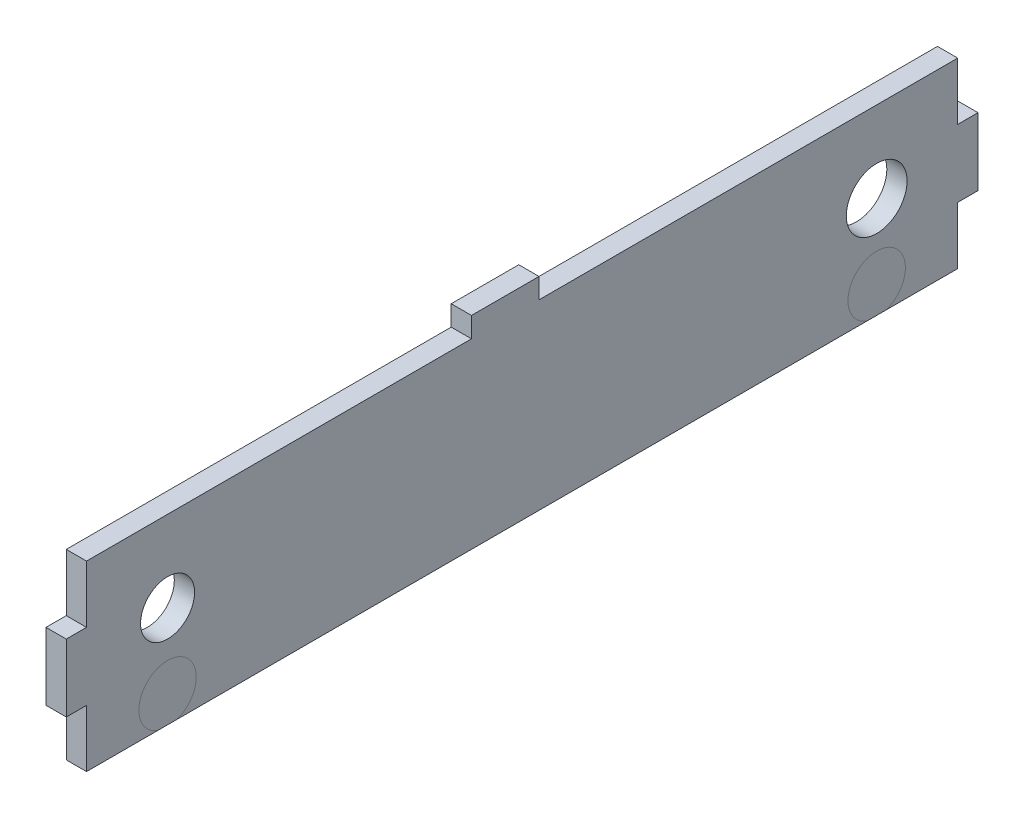
ISO-10303-21;
HEADER;
FILE_DESCRIPTION(('STEP AP214'),'2;1');
FILE_NAME('part.step','',(''),(''),'','','');
FILE_SCHEMA(('AUTOMOTIVE_DESIGN { 1 0 10303 214 1 1 1 1 }'));
ENDSEC;
DATA;
#1=APPLICATION_CONTEXT('core data for automotive mechanical design processes');
#2=APPLICATION_PROTOCOL_DEFINITION('international standard','automotive_design',2000,#1);
#3=PRODUCT_CONTEXT('',#1,'mechanical');
#4=PRODUCT('Part','Part','',(#3));
#5=PRODUCT_RELATED_PRODUCT_CATEGORY('part','',(#4));
#6=PRODUCT_DEFINITION_FORMATION('','',#4);
#7=PRODUCT_DEFINITION_CONTEXT('part definition',#1,'design');
#8=PRODUCT_DEFINITION('design','',#6,#7);
#9=PRODUCT_DEFINITION_SHAPE('','',#8);
#10=(LENGTH_UNIT() NAMED_UNIT(*) SI_UNIT(.MILLI.,.METRE.));
#11=(NAMED_UNIT(*) PLANE_ANGLE_UNIT() SI_UNIT($,.RADIAN.));
#12=(NAMED_UNIT(*) SI_UNIT($,.STERADIAN.) SOLID_ANGLE_UNIT());
#13=UNCERTAINTY_MEASURE_WITH_UNIT(LENGTH_MEASURE(1.E-05),#10,'distance_accuracy_value','');
#14=(GEOMETRIC_REPRESENTATION_CONTEXT(3) GLOBAL_UNCERTAINTY_ASSIGNED_CONTEXT((#13)) GLOBAL_UNIT_ASSIGNED_CONTEXT((#10,
#11,#12)) REPRESENTATION_CONTEXT('',''));
#15=CARTESIAN_POINT('',(0.,0.,0.));
#16=DIRECTION('',(0.,0.,1.));
#17=DIRECTION('',(1.,0.,0.));
#18=AXIS2_PLACEMENT_3D('',#15,#16,#17);
#19=CARTESIAN_POINT('',(-313.51,39.5000001110803,221.989999999999));
#20=CARTESIAN_POINT('',(-313.51,39.5000001110803,225.009999999999));
#21=CARTESIAN_POINT('',(-310.49,39.5000001110803,221.989999999999));
#22=CARTESIAN_POINT('',(-310.49,39.5000001110803,225.009999999999));
#23=(BOUNDED_SURFACE() B_SPLINE_SURFACE(1,1,((#19,#20),(#21,#22)),.UNSPECIFIED.,.F.,.F.,
.F.) B_SPLINE_SURFACE_WITH_KNOTS((2,2),(2,2),(-0.001,0.301),(-0.001,0.301),
.UNSPECIFIED.) GEOMETRIC_REPRESENTATION_ITEM() RATIONAL_B_SPLINE_SURFACE(((1.,1.),(1.,1.))) REPRESENTATION_ITEM('') SURFACE());
#24=CARTESIAN_POINT('',(-310.5,39.5000001110803,221.999999999999));
#25=CARTESIAN_POINT('',(-313.5,39.5000001110803,221.999999999999));
#26=(BOUNDED_CURVE() B_SPLINE_CURVE(1,(#24,#25),.UNSPECIFIED.,.F.,
.F.) B_SPLINE_CURVE_WITH_KNOTS((2,2),(-0.15,0.15),
.UNSPECIFIED.) CURVE() GEOMETRIC_REPRESENTATION_ITEM() RATIONAL_B_SPLINE_CURVE((1.,1.)) REPRESENTATION_ITEM(''));
#27=CARTESIAN_POINT('',(-310.5,39.5000001110803,221.999999999999));
#28=VERTEX_POINT('',#27);
#29=CARTESIAN_POINT('',(-313.5,39.5000001110803,221.999999999999));
#30=VERTEX_POINT('',#29);
#31=EDGE_CURVE('E64',#28,#30,#26,.T.);
#32=CARTESIAN_POINT('',(-310.5,39.5000001110803,221.999999999999));
#33=CARTESIAN_POINT('',(-310.5,39.5000001110803,224.999999999999));
#34=(BOUNDED_CURVE() B_SPLINE_CURVE(1,(#32,#33),.UNSPECIFIED.,.F.,
.F.) B_SPLINE_CURVE_WITH_KNOTS((2,2),(0.,0.3),
.UNSPECIFIED.) CURVE() GEOMETRIC_REPRESENTATION_ITEM() RATIONAL_B_SPLINE_CURVE((1.,1.)) REPRESENTATION_ITEM(''));
#35=CARTESIAN_POINT('',(-310.5,39.5000001110803,224.999999999999));
#36=VERTEX_POINT('',#35);
#37=EDGE_CURVE('E49',#28,#36,#34,.T.);
#38=CARTESIAN_POINT('',(-313.5,39.5000001110803,224.999999999999));
#39=CARTESIAN_POINT('',(-310.5,39.5000001110803,224.999999999999));
#40=(BOUNDED_CURVE() B_SPLINE_CURVE(1,(#38,#39),.UNSPECIFIED.,.F.,
.F.) B_SPLINE_CURVE_WITH_KNOTS((2,2),(-0.3,0.),
.UNSPECIFIED.) CURVE() GEOMETRIC_REPRESENTATION_ITEM() RATIONAL_B_SPLINE_CURVE((1.,1.)) REPRESENTATION_ITEM(''));
#41=CARTESIAN_POINT('',(-313.5,39.5000001110803,224.999999999999));
#42=VERTEX_POINT('',#41);
#43=EDGE_CURVE('E335',#42,#36,#40,.T.);
#44=CARTESIAN_POINT('',(-313.5,39.5000001110803,221.999999999999));
#45=CARTESIAN_POINT('',(-313.5,39.5000001110803,224.999999999999));
#46=(BOUNDED_CURVE() B_SPLINE_CURVE(1,(#44,#45),.UNSPECIFIED.,.F.,
.F.) B_SPLINE_CURVE_WITH_KNOTS((2,2),(0.,0.3),
.UNSPECIFIED.) CURVE() GEOMETRIC_REPRESENTATION_ITEM() RATIONAL_B_SPLINE_CURVE((1.,1.)) REPRESENTATION_ITEM(''));
#47=EDGE_CURVE('E221',#30,#42,#46,.T.);
#48=ORIENTED_EDGE('',*,*,#31,.F.);
#49=ORIENTED_EDGE('',*,*,#37,.T.);
#50=ORIENTED_EDGE('',*,*,#43,.F.);
#51=ORIENTED_EDGE('',*,*,#47,.F.);
#52=EDGE_LOOP('',(#48,#49,#50,#51));
#53=FACE_BOUND('',#52,.T.);
#54=ADVANCED_FACE('F39',(#53),#23,.T.);
#55=CARTESIAN_POINT('',(-310.49,49.5000001110803,221.989999999999));
#56=CARTESIAN_POINT('',(-310.49,49.5000001110803,225.009999999999));
#57=CARTESIAN_POINT('',(-313.51,49.5000001110803,221.989999999999));
#58=CARTESIAN_POINT('',(-313.51,49.5000001110803,225.009999999999));
#59=(BOUNDED_SURFACE() B_SPLINE_SURFACE(1,1,((#55,#56),(#57,#58)),.UNSPECIFIED.,.F.,.F.,
.F.) B_SPLINE_SURFACE_WITH_KNOTS((2,2),(2,2),(-0.001,0.301),(-0.001,0.301),
.UNSPECIFIED.) GEOMETRIC_REPRESENTATION_ITEM() RATIONAL_B_SPLINE_SURFACE(((1.,1.),(1.,1.))) REPRESENTATION_ITEM('') SURFACE());
#60=CARTESIAN_POINT('',(-313.5,49.5000001110803,221.999999999999));
#61=CARTESIAN_POINT('',(-310.5,49.5000001110803,221.999999999999));
#62=(BOUNDED_CURVE() B_SPLINE_CURVE(1,(#60,#61),.UNSPECIFIED.,.F.,
.F.) B_SPLINE_CURVE_WITH_KNOTS((2,2),(-0.3,0.),
.UNSPECIFIED.) CURVE() GEOMETRIC_REPRESENTATION_ITEM() RATIONAL_B_SPLINE_CURVE((1.,1.)) REPRESENTATION_ITEM(''));
#63=CARTESIAN_POINT('',(-313.5,49.5000001110803,221.999999999999));
#64=VERTEX_POINT('',#63);
#65=CARTESIAN_POINT('',(-310.5,49.5000001110803,221.999999999999));
#66=VERTEX_POINT('',#65);
#67=EDGE_CURVE('E336',#64,#66,#62,.T.);
#68=CARTESIAN_POINT('',(-313.5,49.5000001110803,221.999999999999));
#69=CARTESIAN_POINT('',(-313.5,49.5000001110803,224.999999999999));
#70=(BOUNDED_CURVE() B_SPLINE_CURVE(1,(#68,#69),.UNSPECIFIED.,.F.,
.F.) B_SPLINE_CURVE_WITH_KNOTS((2,2),(0.,0.3),
.UNSPECIFIED.) CURVE() GEOMETRIC_REPRESENTATION_ITEM() RATIONAL_B_SPLINE_CURVE((1.,1.)) REPRESENTATION_ITEM(''));
#71=CARTESIAN_POINT('',(-313.5,49.5000001110803,224.999999999999));
#72=VERTEX_POINT('',#71);
#73=EDGE_CURVE('E344',#64,#72,#70,.T.);
#74=CARTESIAN_POINT('',(-310.5,49.5000001110803,224.999999999999));
#75=CARTESIAN_POINT('',(-313.5,49.5000001110803,224.999999999999));
#76=(BOUNDED_CURVE() B_SPLINE_CURVE(1,(#74,#75),.UNSPECIFIED.,.F.,
.F.) B_SPLINE_CURVE_WITH_KNOTS((2,2),(0.,0.3),
.UNSPECIFIED.) CURVE() GEOMETRIC_REPRESENTATION_ITEM() RATIONAL_B_SPLINE_CURVE((1.,1.)) REPRESENTATION_ITEM(''));
#77=CARTESIAN_POINT('',(-310.5,49.5000001110803,224.999999999999));
#78=VERTEX_POINT('',#77);
#79=EDGE_CURVE('E90',#78,#72,#76,.T.);
#80=CARTESIAN_POINT('',(-310.5,49.5000001110803,221.999999999999));
#81=CARTESIAN_POINT('',(-310.5,49.5000001110803,224.999999999999));
#82=(BOUNDED_CURVE() B_SPLINE_CURVE(1,(#80,#81),.UNSPECIFIED.,.F.,
.F.) B_SPLINE_CURVE_WITH_KNOTS((2,2),(0.,0.3),
.UNSPECIFIED.) CURVE() GEOMETRIC_REPRESENTATION_ITEM() RATIONAL_B_SPLINE_CURVE((1.,1.)) REPRESENTATION_ITEM(''));
#83=EDGE_CURVE('E82',#66,#78,#82,.T.);
#84=ORIENTED_EDGE('',*,*,#67,.F.);
#85=ORIENTED_EDGE('',*,*,#73,.T.);
#86=ORIENTED_EDGE('',*,*,#79,.F.);
#87=ORIENTED_EDGE('',*,*,#83,.F.);
#88=EDGE_LOOP('',(#84,#85,#86,#87));
#89=FACE_BOUND('',#88,.T.);
#90=ADVANCED_FACE('F623',(#89),#59,.T.);
#91=CARTESIAN_POINT('',(-313.51,49.5100001110803,224.999999999999));
#92=CARTESIAN_POINT('',(-310.49,49.5100001110803,224.999999999999));
#93=CARTESIAN_POINT('',(-313.51,39.4900001110803,224.999999999999));
#94=CARTESIAN_POINT('',(-310.49,39.4900001110803,224.999999999999));
#95=(BOUNDED_SURFACE() B_SPLINE_SURFACE(1,1,((#91,#92),(#93,#94)),.UNSPECIFIED.,.F.,.F.,
.F.) B_SPLINE_SURFACE_WITH_KNOTS((2,2),(2,2),(-0.501,0.501),(-0.151,0.151),
.UNSPECIFIED.) GEOMETRIC_REPRESENTATION_ITEM() RATIONAL_B_SPLINE_SURFACE(((1.,1.),(1.,1.))) REPRESENTATION_ITEM('') SURFACE());
#96=CARTESIAN_POINT('',(-310.5,39.5000001110803,224.999999999999));
#97=CARTESIAN_POINT('',(-310.5,49.5000001110803,224.999999999999));
#98=(BOUNDED_CURVE() B_SPLINE_CURVE(1,(#96,#97),.UNSPECIFIED.,.F.,
.F.) B_SPLINE_CURVE_WITH_KNOTS((2,2),(0.850000011108212,1.85000001110821),
.UNSPECIFIED.) CURVE() GEOMETRIC_REPRESENTATION_ITEM() RATIONAL_B_SPLINE_CURVE((1.,1.)) REPRESENTATION_ITEM(''));
#99=EDGE_CURVE('E476',#36,#78,#98,.T.);
#100=CARTESIAN_POINT('',(-313.5,49.5000001110803,224.999999999999));
#101=CARTESIAN_POINT('',(-313.5,39.5000001110803,224.999999999999));
#102=(BOUNDED_CURVE() B_SPLINE_CURVE(1,(#100,#101),.UNSPECIFIED.,.F.,
.F.) B_SPLINE_CURVE_WITH_KNOTS((2,2),(0.850000011108212,1.85000001110821),
.UNSPECIFIED.) CURVE() GEOMETRIC_REPRESENTATION_ITEM() RATIONAL_B_SPLINE_CURVE((1.,1.)) REPRESENTATION_ITEM(''));
#103=EDGE_CURVE('E345',#72,#42,#102,.T.);
#104=ORIENTED_EDGE('',*,*,#99,.T.);
#105=ORIENTED_EDGE('',*,*,#79,.T.);
#106=ORIENTED_EDGE('',*,*,#103,.T.);
#107=ORIENTED_EDGE('',*,*,#43,.T.);
#108=EDGE_LOOP('',(#104,#105,#106,#107));
#109=FACE_BOUND('',#108,.T.);
#110=ADVANCED_FACE('F596',(#109),#95,.T.);
#111=CARTESIAN_POINT('',(-310.49,19.9899961853027,221.999999999999));
#112=CARTESIAN_POINT('',(-313.51,19.9899961853027,221.999999999999));
#113=CARTESIAN_POINT('',(-310.49,39.5100001110803,221.999999999999));
#114=CARTESIAN_POINT('',(-313.51,39.5100001110803,221.999999999999));
#115=(BOUNDED_SURFACE() B_SPLINE_SURFACE(1,1,((#111,#112),(#113,#114)),.UNSPECIFIED.,.F.,.F.,
.F.) B_SPLINE_SURFACE_WITH_KNOTS((2,2),(2,2),(-1.10100038146954,0.851000011108213),(-0.001,
0.301),.UNSPECIFIED.) GEOMETRIC_REPRESENTATION_ITEM() RATIONAL_B_SPLINE_SURFACE(((1.,1.),(1.,1.))) REPRESENTATION_ITEM('') SURFACE());
#116=DIRECTION('',(-1.,0.,0.));
#117=VECTOR('',#116,1.);
#118=CARTESIAN_POINT('',(-312.,30.9999961853027,221.999999999999));
#119=LINE('',#118,#117);
#120=CARTESIAN_POINT('',(-310.5,30.9999961853027,221.999999999999));
#121=VERTEX_POINT('',#120);
#122=CARTESIAN_POINT('',(-313.5,30.9999961853027,221.999999999999));
#123=VERTEX_POINT('',#122);
#124=EDGE_CURVE('E195',#121,#123,#119,.T.);
#125=CARTESIAN_POINT('',(-310.5,39.5000001110803,221.999999999999));
#126=CARTESIAN_POINT('',(-310.5,19.9999961853027,221.999999999999));
#127=(BOUNDED_CURVE() B_SPLINE_CURVE(1,(#125,#126),.UNSPECIFIED.,.F.,
.F.) B_SPLINE_CURVE_WITH_KNOTS((2,2),(4.39999998889179,6.35000038146954),
.UNSPECIFIED.) CURVE() GEOMETRIC_REPRESENTATION_ITEM() RATIONAL_B_SPLINE_CURVE((1.,1.)) REPRESENTATION_ITEM(''));
#128=EDGE_CURVE('E398',#28,#121,#127,.T.);
#129=CARTESIAN_POINT('',(-313.5,19.9999961853027,221.999999999999));
#130=CARTESIAN_POINT('',(-313.5,39.5000001110803,221.999999999999));
#131=(BOUNDED_CURVE() B_SPLINE_CURVE(1,(#129,#130),.UNSPECIFIED.,.F.,
.F.) B_SPLINE_CURVE_WITH_KNOTS((2,2),(-6.35000038146954,-4.39999998889179),
.UNSPECIFIED.) CURVE() GEOMETRIC_REPRESENTATION_ITEM() RATIONAL_B_SPLINE_CURVE((1.,1.)) REPRESENTATION_ITEM(''));
#132=EDGE_CURVE('E211',#123,#30,#131,.T.);
#133=ORIENTED_EDGE('',*,*,#124,.F.);
#134=ORIENTED_EDGE('',*,*,#128,.F.);
#135=ORIENTED_EDGE('',*,*,#31,.T.);
#136=ORIENTED_EDGE('',*,*,#132,.F.);
#137=EDGE_LOOP('',(#133,#134,#135,#136));
#138=FACE_BOUND('',#137,.T.);
#139=ADVANCED_FACE('F218',(#138),#115,.T.);
#140=CARTESIAN_POINT('',(-310.49,49.4900001110803,221.999999999999));
#141=CARTESIAN_POINT('',(-313.51,49.4900001110803,221.999999999999));
#142=CARTESIAN_POINT('',(-310.49,58.0100002221624,221.999999999999));
#143=CARTESIAN_POINT('',(-313.51,58.0100002221624,221.999999999999));
#144=(BOUNDED_SURFACE() B_SPLINE_SURFACE(1,1,((#140,#141),(#142,#143)),.UNSPECIFIED.,.F.,.F.,
.F.) B_SPLINE_SURFACE_WITH_KNOTS((2,2),(2,2),(1.84900001110821,2.70100002221642),(-0.001,0.301),
.UNSPECIFIED.) GEOMETRIC_REPRESENTATION_ITEM() RATIONAL_B_SPLINE_SURFACE(((1.,1.),(1.,1.))) REPRESENTATION_ITEM('') SURFACE());
#145=CARTESIAN_POINT('',(-310.5,58.0000002221624,221.999999999999));
#146=CARTESIAN_POINT('',(-310.5,49.5000001110803,221.999999999999));
#147=(BOUNDED_CURVE() B_SPLINE_CURVE(1,(#145,#146),.UNSPECIFIED.,.F.,
.F.) B_SPLINE_CURVE_WITH_KNOTS((2,2),(2.54999997778358,3.39999998889179),
.UNSPECIFIED.) CURVE() GEOMETRIC_REPRESENTATION_ITEM() RATIONAL_B_SPLINE_CURVE((1.,1.)) REPRESENTATION_ITEM(''));
#148=CARTESIAN_POINT('',(-310.5,58.0000002221624,221.999999999999));
#149=VERTEX_POINT('',#148);
#150=EDGE_CURVE('E454',#149,#66,#147,.T.);
#151=CARTESIAN_POINT('',(-310.5,58.0000002221624,221.999999999999));
#152=CARTESIAN_POINT('',(-313.5,58.0000002221624,221.999999999999));
#153=(BOUNDED_CURVE() B_SPLINE_CURVE(1,(#151,#152),.UNSPECIFIED.,.F.,
.F.) B_SPLINE_CURVE_WITH_KNOTS((2,2),(0.,0.3),
.UNSPECIFIED.) CURVE() GEOMETRIC_REPRESENTATION_ITEM() RATIONAL_B_SPLINE_CURVE((1.,1.)) REPRESENTATION_ITEM(''));
#154=CARTESIAN_POINT('',(-313.5,58.0000002221624,221.999999999999));
#155=VERTEX_POINT('',#154);
#156=EDGE_CURVE('E271',#149,#155,#153,.T.);
#157=CARTESIAN_POINT('',(-313.5,49.5000001110803,221.999999999999));
#158=CARTESIAN_POINT('',(-313.5,58.0000002221624,221.999999999999));
#159=(BOUNDED_CURVE() B_SPLINE_CURVE(1,(#157,#158),.UNSPECIFIED.,.F.,
.F.) B_SPLINE_CURVE_WITH_KNOTS((2,2),(-3.39999998889179,-2.54999997778358),
.UNSPECIFIED.) CURVE() GEOMETRIC_REPRESENTATION_ITEM() RATIONAL_B_SPLINE_CURVE((1.,1.)) REPRESENTATION_ITEM(''));
#160=EDGE_CURVE('E231',#64,#155,#159,.T.);
#161=ORIENTED_EDGE('',*,*,#67,.T.);
#162=ORIENTED_EDGE('',*,*,#150,.F.);
#163=ORIENTED_EDGE('',*,*,#156,.T.);
#164=ORIENTED_EDGE('',*,*,#160,.F.);
#165=EDGE_LOOP('',(#161,#162,#163,#164));
#166=FACE_BOUND('',#165,.T.);
#167=ADVANCED_FACE('F720',(#166),#144,.T.);
#168=CARTESIAN_POINT('',(-313.51,49.5000001110803,93.009999999999));
#169=CARTESIAN_POINT('',(-313.51,49.5000001110803,89.989999999999));
#170=CARTESIAN_POINT('',(-310.49,49.5000001110803,93.009999999999));
#171=CARTESIAN_POINT('',(-310.49,49.5000001110803,89.989999999999));
#172=(BOUNDED_SURFACE() B_SPLINE_SURFACE(1,1,((#168,#169),(#170,#171)),.UNSPECIFIED.,.F.,.F.,
.F.) B_SPLINE_SURFACE_WITH_KNOTS((2,2),(2,2),(-0.001,0.301000000000004),(0.499,0.801),
.UNSPECIFIED.) GEOMETRIC_REPRESENTATION_ITEM() RATIONAL_B_SPLINE_SURFACE(((1.,1.),(1.,1.))) REPRESENTATION_ITEM('') SURFACE());
#173=CARTESIAN_POINT('',(-310.5,49.5000001110803,92.999999999999));
#174=CARTESIAN_POINT('',(-313.5,49.5000001110803,92.999999999999));
#175=(BOUNDED_CURVE() B_SPLINE_CURVE(1,(#173,#174),.UNSPECIFIED.,.F.,
.F.) B_SPLINE_CURVE_WITH_KNOTS((2,2),(-0.15,0.15),
.UNSPECIFIED.) CURVE() GEOMETRIC_REPRESENTATION_ITEM() RATIONAL_B_SPLINE_CURVE((1.,1.)) REPRESENTATION_ITEM(''));
#176=CARTESIAN_POINT('',(-310.5,49.5000001110803,92.999999999999));
#177=VERTEX_POINT('',#176);
#178=CARTESIAN_POINT('',(-313.5,49.5000001110803,92.999999999999));
#179=VERTEX_POINT('',#178);
#180=EDGE_CURVE('E493',#177,#179,#175,.T.);
#181=CARTESIAN_POINT('',(-310.5,49.5000001110803,92.999999999999));
#182=CARTESIAN_POINT('',(-310.5,49.5000001110803,89.999999999999));
#183=(BOUNDED_CURVE() B_SPLINE_CURVE(1,(#181,#182),.UNSPECIFIED.,.F.,
.F.) B_SPLINE_CURVE_WITH_KNOTS((2,2),(0.5,0.8),
.UNSPECIFIED.) CURVE() GEOMETRIC_REPRESENTATION_ITEM() RATIONAL_B_SPLINE_CURVE((1.,1.)) REPRESENTATION_ITEM(''));
#184=CARTESIAN_POINT('',(-310.5,49.5000001110803,89.999999999999));
#185=VERTEX_POINT('',#184);
#186=EDGE_CURVE('E262',#177,#185,#183,.T.);
#187=CARTESIAN_POINT('',(-313.5,49.5000001110803,89.999999999999));
#188=CARTESIAN_POINT('',(-310.5,49.5000001110803,89.999999999999));
#189=(BOUNDED_CURVE() B_SPLINE_CURVE(1,(#187,#188),.UNSPECIFIED.,.F.,
.F.) B_SPLINE_CURVE_WITH_KNOTS((2,2),(0.,0.3),
.UNSPECIFIED.) CURVE() GEOMETRIC_REPRESENTATION_ITEM() RATIONAL_B_SPLINE_CURVE((1.,1.)) REPRESENTATION_ITEM(''));
#190=CARTESIAN_POINT('',(-313.5,49.5000001110803,89.999999999999));
#191=VERTEX_POINT('',#190);
#192=EDGE_CURVE('E429',#191,#185,#189,.T.);
#193=CARTESIAN_POINT('',(-313.5,49.5000001110803,92.999999999999));
#194=CARTESIAN_POINT('',(-313.5,49.5000001110803,89.999999999999));
#195=(BOUNDED_CURVE() B_SPLINE_CURVE(1,(#193,#194),.UNSPECIFIED.,.F.,
.F.) B_SPLINE_CURVE_WITH_KNOTS((2,2),(0.5,0.8),
.UNSPECIFIED.) CURVE() GEOMETRIC_REPRESENTATION_ITEM() RATIONAL_B_SPLINE_CURVE((1.,1.)) REPRESENTATION_ITEM(''));
#196=EDGE_CURVE('E228',#179,#191,#195,.T.);
#197=ORIENTED_EDGE('',*,*,#180,.F.);
#198=ORIENTED_EDGE('',*,*,#186,.T.);
#199=ORIENTED_EDGE('',*,*,#192,.F.);
#200=ORIENTED_EDGE('',*,*,#196,.F.);
#201=EDGE_LOOP('',(#197,#198,#199,#200));
#202=FACE_BOUND('',#201,.T.);
#203=ADVANCED_FACE('F41',(#202),#172,.T.);
#204=CARTESIAN_POINT('',(-310.49,39.5000001110803,93.009999999999));
#205=CARTESIAN_POINT('',(-310.49,39.5000001110803,89.989999999999));
#206=CARTESIAN_POINT('',(-313.51,39.5000001110803,93.009999999999));
#207=CARTESIAN_POINT('',(-313.51,39.5000001110803,89.989999999999));
#208=(BOUNDED_SURFACE() B_SPLINE_SURFACE(1,1,((#204,#205),(#206,#207)),.UNSPECIFIED.,.F.,.F.,
.F.) B_SPLINE_SURFACE_WITH_KNOTS((2,2),(2,2),(-0.00100000000000178,0.301),(-0.001,0.301),
.UNSPECIFIED.) GEOMETRIC_REPRESENTATION_ITEM() RATIONAL_B_SPLINE_SURFACE(((1.,1.),(1.,1.))) REPRESENTATION_ITEM('') SURFACE());
#209=CARTESIAN_POINT('',(-313.5,39.5000001110803,92.999999999999));
#210=CARTESIAN_POINT('',(-310.5,39.5000001110803,92.999999999999));
#211=(BOUNDED_CURVE() B_SPLINE_CURVE(1,(#209,#210),.UNSPECIFIED.,.F.,
.F.) B_SPLINE_CURVE_WITH_KNOTS((2,2),(-0.3,0.),
.UNSPECIFIED.) CURVE() GEOMETRIC_REPRESENTATION_ITEM() RATIONAL_B_SPLINE_CURVE((1.,1.)) REPRESENTATION_ITEM(''));
#212=CARTESIAN_POINT('',(-313.5,39.5000001110803,92.999999999999));
#213=VERTEX_POINT('',#212);
#214=CARTESIAN_POINT('',(-310.5,39.5000001110803,92.999999999999));
#215=VERTEX_POINT('',#214);
#216=EDGE_CURVE('E484',#213,#215,#211,.T.);
#217=CARTESIAN_POINT('',(-313.5,39.5000001110803,92.999999999999));
#218=CARTESIAN_POINT('',(-313.5,39.5000001110803,89.999999999999));
#219=(BOUNDED_CURVE() B_SPLINE_CURVE(1,(#217,#218),.UNSPECIFIED.,.F.,
.F.) B_SPLINE_CURVE_WITH_KNOTS((2,2),(0.,0.3),
.UNSPECIFIED.) CURVE() GEOMETRIC_REPRESENTATION_ITEM() RATIONAL_B_SPLINE_CURVE((1.,1.)) REPRESENTATION_ITEM(''));
#220=CARTESIAN_POINT('',(-313.5,39.5000001110803,89.999999999999));
#221=VERTEX_POINT('',#220);
#222=EDGE_CURVE('E272',#213,#221,#219,.T.);
#223=CARTESIAN_POINT('',(-310.5,39.5000001110803,89.999999999999));
#224=CARTESIAN_POINT('',(-313.5,39.5000001110803,89.999999999999));
#225=(BOUNDED_CURVE() B_SPLINE_CURVE(1,(#223,#224),.UNSPECIFIED.,.F.,
.F.) B_SPLINE_CURVE_WITH_KNOTS((2,2),(-0.3,0.),
.UNSPECIFIED.) CURVE() GEOMETRIC_REPRESENTATION_ITEM() RATIONAL_B_SPLINE_CURVE((1.,1.)) REPRESENTATION_ITEM(''));
#226=CARTESIAN_POINT('',(-310.5,39.5000001110803,89.999999999999));
#227=VERTEX_POINT('',#226);
#228=EDGE_CURVE('E283',#227,#221,#225,.T.);
#229=CARTESIAN_POINT('',(-310.5,39.5000001110803,92.999999999999));
#230=CARTESIAN_POINT('',(-310.5,39.5000001110803,89.999999999999));
#231=(BOUNDED_CURVE() B_SPLINE_CURVE(1,(#229,#230),.UNSPECIFIED.,.F.,
.F.) B_SPLINE_CURVE_WITH_KNOTS((2,2),(0.,0.3),
.UNSPECIFIED.) CURVE() GEOMETRIC_REPRESENTATION_ITEM() RATIONAL_B_SPLINE_CURVE((1.,1.)) REPRESENTATION_ITEM(''));
#232=EDGE_CURVE('E237',#215,#227,#231,.T.);
#233=ORIENTED_EDGE('',*,*,#216,.F.);
#234=ORIENTED_EDGE('',*,*,#222,.T.);
#235=ORIENTED_EDGE('',*,*,#228,.F.);
#236=ORIENTED_EDGE('',*,*,#232,.F.);
#237=EDGE_LOOP('',(#233,#234,#235,#236));
#238=FACE_BOUND('',#237,.T.);
#239=ADVANCED_FACE('F719',(#238),#208,.T.);
#240=CARTESIAN_POINT('',(-313.51,39.4900001110803,89.999999999999));
#241=CARTESIAN_POINT('',(-310.49,39.4900001110803,89.999999999999));
#242=CARTESIAN_POINT('',(-313.51,49.5100001110803,89.999999999999));
#243=CARTESIAN_POINT('',(-310.49,49.5100001110803,89.999999999999));
#244=(BOUNDED_SURFACE() B_SPLINE_SURFACE(1,1,((#240,#241),(#242,#243)),.UNSPECIFIED.,.F.,.F.,
.F.) B_SPLINE_SURFACE_WITH_KNOTS((2,2),(2,2),(-0.501,0.501),(-0.151,0.151),
.UNSPECIFIED.) GEOMETRIC_REPRESENTATION_ITEM() RATIONAL_B_SPLINE_SURFACE(((1.,1.),(1.,1.))) REPRESENTATION_ITEM('') SURFACE());
#245=CARTESIAN_POINT('',(-313.5,39.5000001110803,89.999999999999));
#246=CARTESIAN_POINT('',(-313.5,49.5000001110803,89.999999999999));
#247=(BOUNDED_CURVE() B_SPLINE_CURVE(1,(#245,#246),.UNSPECIFIED.,.F.,
.F.) B_SPLINE_CURVE_WITH_KNOTS((2,2),(0.850000011108214,1.85000001110821),
.UNSPECIFIED.) CURVE() GEOMETRIC_REPRESENTATION_ITEM() RATIONAL_B_SPLINE_CURVE((1.,1.)) REPRESENTATION_ITEM(''));
#248=EDGE_CURVE('E291',#221,#191,#247,.T.);
#249=CARTESIAN_POINT('',(-310.5,49.5000001110803,89.999999999999));
#250=CARTESIAN_POINT('',(-310.5,39.5000001110803,89.999999999999));
#251=(BOUNDED_CURVE() B_SPLINE_CURVE(1,(#249,#250),.UNSPECIFIED.,.F.,
.F.) B_SPLINE_CURVE_WITH_KNOTS((2,2),(0.85000001110821,1.85000001110821),
.UNSPECIFIED.) CURVE() GEOMETRIC_REPRESENTATION_ITEM() RATIONAL_B_SPLINE_CURVE((1.,1.)) REPRESENTATION_ITEM(''));
#252=EDGE_CURVE('E436',#185,#227,#251,.T.);
#253=ORIENTED_EDGE('',*,*,#228,.T.);
#254=ORIENTED_EDGE('',*,*,#248,.T.);
#255=ORIENTED_EDGE('',*,*,#192,.T.);
#256=ORIENTED_EDGE('',*,*,#252,.T.);
#257=EDGE_LOOP('',(#253,#254,#255,#256));
#258=FACE_BOUND('',#257,.T.);
#259=ADVANCED_FACE('F745',(#258),#244,.T.);
#260=CARTESIAN_POINT('',(-310.49,58.0100002221624,92.999999999999));
#261=CARTESIAN_POINT('',(-313.51,58.0100002221624,92.999999999999));
#262=CARTESIAN_POINT('',(-310.49,49.4900001110803,92.999999999999));
#263=CARTESIAN_POINT('',(-313.51,49.4900001110803,92.999999999999));
#264=(BOUNDED_SURFACE() B_SPLINE_SURFACE(1,1,((#260,#261),(#262,#263)),.UNSPECIFIED.,.F.,.F.,
.F.) B_SPLINE_SURFACE_WITH_KNOTS((2,2),(2,2),(-0.0152817318439183,0.836718279264296),
(-0.00100000000000178,0.301),
.UNSPECIFIED.) GEOMETRIC_REPRESENTATION_ITEM() RATIONAL_B_SPLINE_SURFACE(((1.,1.),(1.,1.))) REPRESENTATION_ITEM('') SURFACE());
#265=CARTESIAN_POINT('',(-313.5,58.0000002221624,92.999999999999));
#266=CARTESIAN_POINT('',(-313.5,49.5000001110803,92.999999999999));
#267=(BOUNDED_CURVE() B_SPLINE_CURVE(1,(#265,#266),.UNSPECIFIED.,.F.,
.F.) B_SPLINE_CURVE_WITH_KNOTS((2,2),(3.89285912296983,4.74285913407804),
.UNSPECIFIED.) CURVE() GEOMETRIC_REPRESENTATION_ITEM() RATIONAL_B_SPLINE_CURVE((1.,1.)) REPRESENTATION_ITEM(''));
#268=CARTESIAN_POINT('',(-313.5,58.0000002221624,92.999999999999));
#269=VERTEX_POINT('',#268);
#270=EDGE_CURVE('E252',#269,#179,#267,.T.);
#271=CARTESIAN_POINT('',(-310.5,58.0000002221624,92.999999999999));
#272=CARTESIAN_POINT('',(-313.5,58.0000002221624,92.999999999999));
#273=(BOUNDED_CURVE() B_SPLINE_CURVE(1,(#271,#272),.UNSPECIFIED.,.F.,
.F.) B_SPLINE_CURVE_WITH_KNOTS((2,2),(0.,0.3),
.UNSPECIFIED.) CURVE() GEOMETRIC_REPRESENTATION_ITEM() RATIONAL_B_SPLINE_CURVE((1.,1.)) REPRESENTATION_ITEM(''));
#274=CARTESIAN_POINT('',(-310.5,58.0000002221624,92.999999999999));
#275=VERTEX_POINT('',#274);
#276=EDGE_CURVE('E292',#275,#269,#273,.T.);
#277=CARTESIAN_POINT('',(-310.5,49.5000001110803,92.999999999999));
#278=CARTESIAN_POINT('',(-310.5,58.0000002221624,92.999999999999));
#279=(BOUNDED_CURVE() B_SPLINE_CURVE(1,(#277,#278),.UNSPECIFIED.,.F.,
.F.) B_SPLINE_CURVE_WITH_KNOTS((2,2),(-4.74285913407804,-3.89285912296983),
.UNSPECIFIED.) CURVE() GEOMETRIC_REPRESENTATION_ITEM() RATIONAL_B_SPLINE_CURVE((1.,1.)) REPRESENTATION_ITEM(''));
#280=EDGE_CURVE('E555',#177,#275,#279,.T.);
#281=ORIENTED_EDGE('',*,*,#180,.T.);
#282=ORIENTED_EDGE('',*,*,#270,.F.);
#283=ORIENTED_EDGE('',*,*,#276,.F.);
#284=ORIENTED_EDGE('',*,*,#280,.F.);
#285=EDGE_LOOP('',(#281,#282,#283,#284));
#286=FACE_BOUND('',#285,.T.);
#287=ADVANCED_FACE('F800',(#286),#264,.T.);
#288=CARTESIAN_POINT('',(-310.49,39.5100001110803,92.999999999999));
#289=CARTESIAN_POINT('',(-313.51,39.5100001110803,92.999999999999));
#290=CARTESIAN_POINT('',(-310.49,19.9899961853027,92.999999999999));
#291=CARTESIAN_POINT('',(-313.51,19.9899961853027,92.999999999999));
#292=(BOUNDED_SURFACE() B_SPLINE_SURFACE(1,1,((#288,#289),(#290,#291)),.UNSPECIFIED.,.F.,.F.,
.F.) B_SPLINE_SURFACE_WITH_KNOTS((2,2),(2,2),(1.8347182792643,3.78671867184205),
(-0.00100000000000178,0.301),
.UNSPECIFIED.) GEOMETRIC_REPRESENTATION_ITEM() RATIONAL_B_SPLINE_SURFACE(((1.,1.),(1.,1.))) REPRESENTATION_ITEM('') SURFACE());
#293=DIRECTION('',(1.,0.,0.));
#294=VECTOR('',#293,1.);
#295=CARTESIAN_POINT('',(-312.,30.9999961853027,92.999999999999));
#296=LINE('',#295,#294);
#297=CARTESIAN_POINT('',(-313.5,30.9999961853027,92.999999999999));
#298=VERTEX_POINT('',#297);
#299=CARTESIAN_POINT('',(-310.5,30.9999961853027,92.999999999999));
#300=VERTEX_POINT('',#299);
#301=EDGE_CURVE('E207',#298,#300,#296,.T.);
#302=CARTESIAN_POINT('',(-313.5,39.5000001110803,92.999999999999));
#303=CARTESIAN_POINT('',(-313.5,19.9999961853027,92.999999999999));
#304=(BOUNDED_CURVE() B_SPLINE_CURVE(1,(#302,#303),.UNSPECIFIED.,.F.,
.F.) B_SPLINE_CURVE_WITH_KNOTS((2,2),(5.74285913407804,7.6928595266558),
.UNSPECIFIED.) CURVE() GEOMETRIC_REPRESENTATION_ITEM() RATIONAL_B_SPLINE_CURVE((1.,1.)) REPRESENTATION_ITEM(''));
#305=EDGE_CURVE('E220',#213,#298,#304,.T.);
#306=CARTESIAN_POINT('',(-310.5,19.9999961853027,92.999999999999));
#307=CARTESIAN_POINT('',(-310.5,39.5000001110803,92.999999999999));
#308=(BOUNDED_CURVE() B_SPLINE_CURVE(1,(#306,#307),.UNSPECIFIED.,.F.,
.F.) B_SPLINE_CURVE_WITH_KNOTS((2,2),(-7.6928595266558,-5.74285913407804),
.UNSPECIFIED.) CURVE() GEOMETRIC_REPRESENTATION_ITEM() RATIONAL_B_SPLINE_CURVE((1.,1.)) REPRESENTATION_ITEM(''));
#309=EDGE_CURVE('E391',#300,#215,#308,.T.);
#310=ORIENTED_EDGE('',*,*,#301,.F.);
#311=ORIENTED_EDGE('',*,*,#305,.F.);
#312=ORIENTED_EDGE('',*,*,#216,.T.);
#313=ORIENTED_EDGE('',*,*,#309,.F.);
#314=EDGE_LOOP('',(#310,#311,#312,#313));
#315=FACE_BOUND('',#314,.T.);
#316=ADVANCED_FACE('F734',(#315),#292,.T.);
#317=CARTESIAN_POINT('',(-313.51,57.9900002221624,164.999999999999));
#318=CARTESIAN_POINT('',(-313.51,61.0100002221624,164.999999999999));
#319=CARTESIAN_POINT('',(-310.49,57.9900002221624,164.999999999999));
#320=CARTESIAN_POINT('',(-310.49,61.0100002221624,164.999999999999));
#321=(BOUNDED_SURFACE() B_SPLINE_SURFACE(1,1,((#317,#318),(#319,#320)),.UNSPECIFIED.,.F.,.F.,
.F.) B_SPLINE_SURFACE_WITH_KNOTS((2,2),(2,2),(-0.001,0.301),(-0.00100000000000006,0.301),
.UNSPECIFIED.) GEOMETRIC_REPRESENTATION_ITEM() RATIONAL_B_SPLINE_SURFACE(((1.,1.),(1.,1.))) REPRESENTATION_ITEM('') SURFACE());
#322=CARTESIAN_POINT('',(-310.5,58.0000002221624,164.999999999999));
#323=CARTESIAN_POINT('',(-313.5,58.0000002221624,164.999999999999));
#324=(BOUNDED_CURVE() B_SPLINE_CURVE(1,(#322,#323),.UNSPECIFIED.,.F.,
.F.) B_SPLINE_CURVE_WITH_KNOTS((2,2),(-0.15,0.15),
.UNSPECIFIED.) CURVE() GEOMETRIC_REPRESENTATION_ITEM() RATIONAL_B_SPLINE_CURVE((1.,1.)) REPRESENTATION_ITEM(''));
#325=CARTESIAN_POINT('',(-310.5,58.0000002221624,164.999999999999));
#326=VERTEX_POINT('',#325);
#327=CARTESIAN_POINT('',(-313.5,58.0000002221624,164.999999999999));
#328=VERTEX_POINT('',#327);
#329=EDGE_CURVE('E319',#326,#328,#324,.T.);
#330=CARTESIAN_POINT('',(-310.5,58.0000002221624,164.999999999999));
#331=CARTESIAN_POINT('',(-310.5,61.0000002221624,164.999999999999));
#332=(BOUNDED_CURVE() B_SPLINE_CURVE(1,(#330,#331),.UNSPECIFIED.,.F.,
.F.) B_SPLINE_CURVE_WITH_KNOTS((2,2),(0.,0.3),
.UNSPECIFIED.) CURVE() GEOMETRIC_REPRESENTATION_ITEM() RATIONAL_B_SPLINE_CURVE((1.,1.)) REPRESENTATION_ITEM(''));
#333=CARTESIAN_POINT('',(-310.5,61.0000002221624,164.999999999999));
#334=VERTEX_POINT('',#333);
#335=EDGE_CURVE('E250',#326,#334,#332,.T.);
#336=CARTESIAN_POINT('',(-313.5,61.0000002221624,164.999999999999));
#337=CARTESIAN_POINT('',(-310.5,61.0000002221624,164.999999999999));
#338=(BOUNDED_CURVE() B_SPLINE_CURVE(1,(#336,#337),.UNSPECIFIED.,.F.,
.F.) B_SPLINE_CURVE_WITH_KNOTS((2,2),(-0.3,0.),
.UNSPECIFIED.) CURVE() GEOMETRIC_REPRESENTATION_ITEM() RATIONAL_B_SPLINE_CURVE((1.,1.)) REPRESENTATION_ITEM(''));
#339=CARTESIAN_POINT('',(-313.5,61.0000002221624,164.999999999999));
#340=VERTEX_POINT('',#339);
#341=EDGE_CURVE('E106',#340,#334,#338,.T.);
#342=CARTESIAN_POINT('',(-313.5,58.0000002221624,164.999999999999));
#343=CARTESIAN_POINT('',(-313.5,61.0000002221624,164.999999999999));
#344=(BOUNDED_CURVE() B_SPLINE_CURVE(1,(#342,#343),.UNSPECIFIED.,.F.,
.F.) B_SPLINE_CURVE_WITH_KNOTS((2,2),(0.,0.3),
.UNSPECIFIED.) CURVE() GEOMETRIC_REPRESENTATION_ITEM() RATIONAL_B_SPLINE_CURVE((1.,1.)) REPRESENTATION_ITEM(''));
#345=EDGE_CURVE('E117',#328,#340,#344,.T.);
#346=ORIENTED_EDGE('',*,*,#329,.F.);
#347=ORIENTED_EDGE('',*,*,#335,.T.);
#348=ORIENTED_EDGE('',*,*,#341,.F.);
#349=ORIENTED_EDGE('',*,*,#345,.F.);
#350=EDGE_LOOP('',(#346,#347,#348,#349));
#351=FACE_BOUND('',#350,.T.);
#352=ADVANCED_FACE('F729',(#351),#321,.T.);
#353=CARTESIAN_POINT('',(-310.49,57.9900002221624,154.999999999999));
#354=CARTESIAN_POINT('',(-310.49,61.0100002221624,154.999999999999));
#355=CARTESIAN_POINT('',(-313.51,57.9900002221624,154.999999999999));
#356=CARTESIAN_POINT('',(-313.51,61.0100002221624,154.999999999999));
#357=(BOUNDED_SURFACE() B_SPLINE_SURFACE(1,1,((#353,#354),(#355,#356)),.UNSPECIFIED.,.F.,.F.,
.F.) B_SPLINE_SURFACE_WITH_KNOTS((2,2),(2,2),(-0.001,0.301),(-0.00100000000000006,0.301),
.UNSPECIFIED.) GEOMETRIC_REPRESENTATION_ITEM() RATIONAL_B_SPLINE_SURFACE(((1.,1.),(1.,1.))) REPRESENTATION_ITEM('') SURFACE());
#358=CARTESIAN_POINT('',(-313.5,58.0000002221624,154.999999999999));
#359=CARTESIAN_POINT('',(-310.5,58.0000002221624,154.999999999999));
#360=(BOUNDED_CURVE() B_SPLINE_CURVE(1,(#358,#359),.UNSPECIFIED.,.F.,
.F.) B_SPLINE_CURVE_WITH_KNOTS((2,2),(-0.3,0.),
.UNSPECIFIED.) CURVE() GEOMETRIC_REPRESENTATION_ITEM() RATIONAL_B_SPLINE_CURVE((1.,1.)) REPRESENTATION_ITEM(''));
#361=CARTESIAN_POINT('',(-313.5,58.0000002221624,154.999999999999));
#362=VERTEX_POINT('',#361);
#363=CARTESIAN_POINT('',(-310.5,58.0000002221624,154.999999999999));
#364=VERTEX_POINT('',#363);
#365=EDGE_CURVE('E301',#362,#364,#360,.T.);
#366=CARTESIAN_POINT('',(-313.5,58.0000002221624,154.999999999999));
#367=CARTESIAN_POINT('',(-313.5,61.0000002221624,154.999999999999));
#368=(BOUNDED_CURVE() B_SPLINE_CURVE(1,(#366,#367),.UNSPECIFIED.,.F.,
.F.) B_SPLINE_CURVE_WITH_KNOTS((2,2),(0.,0.3),
.UNSPECIFIED.) CURVE() GEOMETRIC_REPRESENTATION_ITEM() RATIONAL_B_SPLINE_CURVE((1.,1.)) REPRESENTATION_ITEM(''));
#369=CARTESIAN_POINT('',(-313.5,61.0000002221624,154.999999999999));
#370=VERTEX_POINT('',#369);
#371=EDGE_CURVE('E241',#362,#370,#368,.T.);
#372=CARTESIAN_POINT('',(-310.5,61.0000002221624,154.999999999999));
#373=CARTESIAN_POINT('',(-313.5,61.0000002221624,154.999999999999));
#374=(BOUNDED_CURVE() B_SPLINE_CURVE(1,(#372,#373),.UNSPECIFIED.,.F.,
.F.) B_SPLINE_CURVE_WITH_KNOTS((2,2),(0.,0.3),
.UNSPECIFIED.) CURVE() GEOMETRIC_REPRESENTATION_ITEM() RATIONAL_B_SPLINE_CURVE((1.,1.)) REPRESENTATION_ITEM(''));
#375=CARTESIAN_POINT('',(-310.5,61.0000002221624,154.999999999999));
#376=VERTEX_POINT('',#375);
#377=EDGE_CURVE('E310',#376,#370,#374,.T.);
#378=CARTESIAN_POINT('',(-310.5,58.0000002221624,154.999999999999));
#379=CARTESIAN_POINT('',(-310.5,61.0000002221624,154.999999999999));
#380=(BOUNDED_CURVE() B_SPLINE_CURVE(1,(#378,#379),.UNSPECIFIED.,.F.,
.F.) B_SPLINE_CURVE_WITH_KNOTS((2,2),(0.,0.3),
.UNSPECIFIED.) CURVE() GEOMETRIC_REPRESENTATION_ITEM() RATIONAL_B_SPLINE_CURVE((1.,1.)) REPRESENTATION_ITEM(''));
#381=EDGE_CURVE('E282',#364,#376,#380,.T.);
#382=ORIENTED_EDGE('',*,*,#365,.F.);
#383=ORIENTED_EDGE('',*,*,#371,.T.);
#384=ORIENTED_EDGE('',*,*,#377,.F.);
#385=ORIENTED_EDGE('',*,*,#381,.F.);
#386=EDGE_LOOP('',(#382,#383,#384,#385));
#387=FACE_BOUND('',#386,.T.);
#388=ADVANCED_FACE('F733',(#387),#357,.T.);
#389=CARTESIAN_POINT('',(-313.51,61.0000002221624,154.989999999999));
#390=CARTESIAN_POINT('',(-310.49,61.0000002221624,154.989999999999));
#391=CARTESIAN_POINT('',(-313.51,61.0000002221624,165.009999999999));
#392=CARTESIAN_POINT('',(-310.49,61.0000002221624,165.009999999999));
#393=(BOUNDED_SURFACE() B_SPLINE_SURFACE(1,1,((#389,#390),(#391,#392)),.UNSPECIFIED.,.F.,.F.,
.F.) B_SPLINE_SURFACE_WITH_KNOTS((2,2),(2,2),(-0.651,0.351),(7.149,7.451),
.UNSPECIFIED.) GEOMETRIC_REPRESENTATION_ITEM() RATIONAL_B_SPLINE_SURFACE(((1.,1.),(1.,1.))) REPRESENTATION_ITEM('') SURFACE());
#394=CARTESIAN_POINT('',(-310.5,61.0000002221624,164.999999999999));
#395=CARTESIAN_POINT('',(-310.5,61.0000002221624,154.999999999999));
#396=(BOUNDED_CURVE() B_SPLINE_CURVE(1,(#394,#395),.UNSPECIFIED.,.F.,
.F.) B_SPLINE_CURVE_WITH_KNOTS((2,2),(-1.,0.),
.UNSPECIFIED.) CURVE() GEOMETRIC_REPRESENTATION_ITEM() RATIONAL_B_SPLINE_CURVE((1.,1.)) REPRESENTATION_ITEM(''));
#397=EDGE_CURVE('E251',#334,#376,#396,.T.);
#398=CARTESIAN_POINT('',(-313.5,61.0000002221624,154.999999999999));
#399=CARTESIAN_POINT('',(-313.5,61.0000002221624,164.999999999999));
#400=(BOUNDED_CURVE() B_SPLINE_CURVE(1,(#398,#399),.UNSPECIFIED.,.F.,
.F.) B_SPLINE_CURVE_WITH_KNOTS((2,2),(-1.,0.),
.UNSPECIFIED.) CURVE() GEOMETRIC_REPRESENTATION_ITEM() RATIONAL_B_SPLINE_CURVE((1.,1.)) REPRESENTATION_ITEM(''));
#401=EDGE_CURVE('E369',#370,#340,#400,.T.);
#402=ORIENTED_EDGE('',*,*,#397,.T.);
#403=ORIENTED_EDGE('',*,*,#377,.T.);
#404=ORIENTED_EDGE('',*,*,#401,.T.);
#405=ORIENTED_EDGE('',*,*,#341,.T.);
#406=EDGE_LOOP('',(#402,#403,#404,#405));
#407=FACE_BOUND('',#406,.T.);
#408=ADVANCED_FACE('F757',(#407),#393,.T.);
#409=CARTESIAN_POINT('',(-310.49,58.0000002221624,222.009999999999));
#410=CARTESIAN_POINT('',(-313.51,58.0000002221624,222.009999999999));
#411=CARTESIAN_POINT('',(-310.49,58.0000002221624,164.989999999999));
#412=CARTESIAN_POINT('',(-313.51,58.0000002221624,164.989999999999));
#413=(BOUNDED_SURFACE() B_SPLINE_SURFACE(1,1,((#409,#410),(#411,#412)),.UNSPECIFIED.,.F.,.F.,
.F.) B_SPLINE_SURFACE_WITH_KNOTS((2,2),(2,2),(0.299,6.001),(-0.001,0.301),
.UNSPECIFIED.) GEOMETRIC_REPRESENTATION_ITEM() RATIONAL_B_SPLINE_SURFACE(((1.,1.),(1.,1.))) REPRESENTATION_ITEM('') SURFACE());
#414=CARTESIAN_POINT('',(-313.5,58.0000002221624,221.999999999999));
#415=CARTESIAN_POINT('',(-313.5,58.0000002221624,164.999999999999));
#416=(BOUNDED_CURVE() B_SPLINE_CURVE(1,(#414,#415),.UNSPECIFIED.,.F.,
.F.) B_SPLINE_CURVE_WITH_KNOTS((2,2),(-2.95,2.75),
.UNSPECIFIED.) CURVE() GEOMETRIC_REPRESENTATION_ITEM() RATIONAL_B_SPLINE_CURVE((1.,1.)) REPRESENTATION_ITEM(''));
#417=EDGE_CURVE('E302',#155,#328,#416,.T.);
#418=CARTESIAN_POINT('',(-310.5,58.0000002221624,164.999999999999));
#419=CARTESIAN_POINT('',(-310.5,58.0000002221624,221.999999999999));
#420=(BOUNDED_CURVE() B_SPLINE_CURVE(1,(#418,#419),.UNSPECIFIED.,.F.,
.F.) B_SPLINE_CURVE_WITH_KNOTS((2,2),(-2.75,2.95),
.UNSPECIFIED.) CURVE() GEOMETRIC_REPRESENTATION_ITEM() RATIONAL_B_SPLINE_CURVE((1.,1.)) REPRESENTATION_ITEM(''));
#421=EDGE_CURVE('E444',#326,#149,#420,.T.);
#422=ORIENTED_EDGE('',*,*,#329,.T.);
#423=ORIENTED_EDGE('',*,*,#417,.F.);
#424=ORIENTED_EDGE('',*,*,#156,.F.);
#425=ORIENTED_EDGE('',*,*,#421,.F.);
#426=EDGE_LOOP('',(#422,#423,#424,#425));
#427=FACE_BOUND('',#426,.T.);
#428=ADVANCED_FACE('F641',(#427),#413,.T.);
#429=CARTESIAN_POINT('',(-310.49,58.0000002221624,155.009999999999));
#430=CARTESIAN_POINT('',(-313.51,58.0000002221624,155.009999999999));
#431=CARTESIAN_POINT('',(-310.49,58.0000002221624,92.989999999999));
#432=CARTESIAN_POINT('',(-313.51,58.0000002221624,92.989999999999));
#433=(BOUNDED_SURFACE() B_SPLINE_SURFACE(1,1,((#429,#430),(#431,#432)),.UNSPECIFIED.,.F.,.F.,
.F.) B_SPLINE_SURFACE_WITH_KNOTS((2,2),(2,2),(6.999,13.201),(-0.00100000000000355,0.301),
.UNSPECIFIED.) GEOMETRIC_REPRESENTATION_ITEM() RATIONAL_B_SPLINE_SURFACE(((1.,1.),(1.,1.))) REPRESENTATION_ITEM('') SURFACE());
#434=CARTESIAN_POINT('',(-310.5,58.0000002221624,92.999999999999));
#435=CARTESIAN_POINT('',(-310.5,58.0000002221624,154.999999999999));
#436=(BOUNDED_CURVE() B_SPLINE_CURVE(1,(#434,#435),.UNSPECIFIED.,.F.,
.F.) B_SPLINE_CURVE_WITH_KNOTS((2,2),(-9.95,-3.75),
.UNSPECIFIED.) CURVE() GEOMETRIC_REPRESENTATION_ITEM() RATIONAL_B_SPLINE_CURVE((1.,1.)) REPRESENTATION_ITEM(''));
#437=EDGE_CURVE('E273',#275,#364,#436,.T.);
#438=CARTESIAN_POINT('',(-313.5,58.0000002221624,154.999999999999));
#439=CARTESIAN_POINT('',(-313.5,58.0000002221624,92.999999999999));
#440=(BOUNDED_CURVE() B_SPLINE_CURVE(1,(#438,#439),.UNSPECIFIED.,.F.,
.F.) B_SPLINE_CURVE_WITH_KNOTS((2,2),(3.75,9.95),
.UNSPECIFIED.) CURVE() GEOMETRIC_REPRESENTATION_ITEM() RATIONAL_B_SPLINE_CURVE((1.,1.)) REPRESENTATION_ITEM(''));
#441=EDGE_CURVE('E261',#362,#269,#440,.T.);
#442=ORIENTED_EDGE('',*,*,#365,.T.);
#443=ORIENTED_EDGE('',*,*,#437,.F.);
#444=ORIENTED_EDGE('',*,*,#276,.T.);
#445=ORIENTED_EDGE('',*,*,#441,.F.);
#446=EDGE_LOOP('',(#442,#443,#444,#445));
#447=FACE_BOUND('',#446,.T.);
#448=ADVANCED_FACE('F613',(#447),#433,.T.);
#449=CARTESIAN_POINT('',(-313.5,61.0100002221624,89.989999999999));
#450=CARTESIAN_POINT('',(-313.5,61.0100002221624,225.009999999999));
#451=CARTESIAN_POINT('',(-313.5,19.9899961853027,89.989999999999));
#452=CARTESIAN_POINT('',(-313.5,19.9899961853027,225.009999999999));
#453=(BOUNDED_SURFACE() B_SPLINE_SURFACE(1,1,((#449,#450),(#451,#452)),.UNSPECIFIED.,.F.,.F.,
.F.) B_SPLINE_SURFACE_WITH_KNOTS((2,2),(2,2),(7.49899997778358,11.6010003814695),(-7.001,6.501),
.UNSPECIFIED.) GEOMETRIC_REPRESENTATION_ITEM() RATIONAL_B_SPLINE_SURFACE(((1.,1.),(1.,1.))) REPRESENTATION_ITEM('') SURFACE());
#454=CARTESIAN_POINT('',(-313.5,46.000000222161,210.));
#455=DIRECTION('',(-1.,0.,0.));
#456=DIRECTION('',(0.,-1.,0.));
#457=AXIS2_PLACEMENT_3D('',#454,#455,#456);
#458=CIRCLE('',#457,3.99999999999999);
#459=CARTESIAN_POINT('',(-313.5,42.000000222161,210.));
#460=VERTEX_POINT('',#459);
#461=EDGE_CURVE('E676',#460,#460,#458,.T.);
#462=CARTESIAN_POINT('',(-313.5,46.0000002221626,105.));
#463=DIRECTION('',(-1.,0.,0.));
#464=DIRECTION('',(0.,1.,0.));
#465=AXIS2_PLACEMENT_3D('',#462,#463,#464);
#466=CIRCLE('',#465,4.50000000000012);
#467=CARTESIAN_POINT('',(-313.5,50.5000002221627,105.));
#468=VERTEX_POINT('',#467);
#469=EDGE_CURVE('E681',#468,#468,#466,.T.);
#470=DIRECTION('',(0.,0.,-1.));
#471=VECTOR('',#470,1.);
#472=CARTESIAN_POINT('',(-313.5,30.9999961853027,234.130008512693));
#473=LINE('',#472,#471);
#474=CARTESIAN_POINT('',(-313.5,30.9999961853027,211.436130036737));
#475=VERTEX_POINT('',#474);
#476=EDGE_CURVE('E198',#123,#475,#473,.T.);
#477=CARTESIAN_POINT('',(-313.5,30.9999961853027,103.563869963261));
#478=VERTEX_POINT('',#477);
#479=EDGE_CURVE('E217',#478,#298,#473,.T.);
#480=CARTESIAN_POINT('',(-313.5,34.9999999999982,104.999999999999));
#481=DIRECTION('',(-1.,0.,0.));
#482=DIRECTION('',(0.,1.,0.));
#483=AXIS2_PLACEMENT_3D('',#480,#481,#482);
#484=CIRCLE('',#483,4.25000000000003);
#485=CARTESIAN_POINT('',(-313.5,30.9999961853027,106.436130036737));
#486=VERTEX_POINT('',#485);
#487=EDGE_CURVE('E206',#486,#478,#484,.T.);
#488=CARTESIAN_POINT('',(-313.5,30.9999961853027,208.563869963261));
#489=VERTEX_POINT('',#488);
#490=EDGE_CURVE('E1305',#489,#486,#473,.T.);
#491=CARTESIAN_POINT('',(-313.5,34.9999999999983,209.999999999999));
#492=DIRECTION('',(-1.,0.,0.));
#493=DIRECTION('',(0.,1.,0.));
#494=AXIS2_PLACEMENT_3D('',#491,#492,#493);
#495=CIRCLE('',#494,4.24999999999998);
#496=EDGE_CURVE('E214',#475,#489,#495,.T.);
#497=ORIENTED_EDGE('',*,*,#461,.F.);
#498=EDGE_LOOP('',(#497));
#499=FACE_BOUND('',#498,.T.);
#500=ORIENTED_EDGE('',*,*,#469,.F.);
#501=EDGE_LOOP('',(#500));
#502=FACE_BOUND('',#501,.T.);
#503=ORIENTED_EDGE('',*,*,#476,.F.);
#504=ORIENTED_EDGE('',*,*,#132,.T.);
#505=ORIENTED_EDGE('',*,*,#47,.T.);
#506=ORIENTED_EDGE('',*,*,#103,.F.);
#507=ORIENTED_EDGE('',*,*,#73,.F.);
#508=ORIENTED_EDGE('',*,*,#160,.T.);
#509=ORIENTED_EDGE('',*,*,#417,.T.);
#510=ORIENTED_EDGE('',*,*,#345,.T.);
#511=ORIENTED_EDGE('',*,*,#401,.F.);
#512=ORIENTED_EDGE('',*,*,#371,.F.);
#513=ORIENTED_EDGE('',*,*,#441,.T.);
#514=ORIENTED_EDGE('',*,*,#270,.T.);
#515=ORIENTED_EDGE('',*,*,#196,.T.);
#516=ORIENTED_EDGE('',*,*,#248,.F.);
#517=ORIENTED_EDGE('',*,*,#222,.F.);
#518=ORIENTED_EDGE('',*,*,#305,.T.);
#519=ORIENTED_EDGE('',*,*,#479,.F.);
#520=ORIENTED_EDGE('',*,*,#487,.F.);
#521=ORIENTED_EDGE('',*,*,#490,.F.);
#522=ORIENTED_EDGE('',*,*,#496,.F.);
#523=EDGE_LOOP('',(#503,#504,#505,#506,#507,#508,#509,#510,#511,#512,#513,#514,#515,#516,#517,
#518,#519,#520,#521,#522));
#524=FACE_BOUND('',#523,.T.);
#525=ADVANCED_FACE('F210',(#499,#502,#524),#453,.T.);
#526=CARTESIAN_POINT('',(-310.5,19.9899961853027,89.989999999999));
#527=CARTESIAN_POINT('',(-310.5,19.9899961853027,225.009999999999));
#528=CARTESIAN_POINT('',(-310.5,61.0100002221624,89.989999999999));
#529=CARTESIAN_POINT('',(-310.5,61.0100002221624,225.009999999999));
#530=(BOUNDED_SURFACE() B_SPLINE_SURFACE(1,1,((#526,#527),(#528,#529)),.UNSPECIFIED.,.F.,.F.,
.F.) B_SPLINE_SURFACE_WITH_KNOTS((2,2),(2,2),(7.49899997778358,11.6010003814695),(-7.001,6.501),
.UNSPECIFIED.) GEOMETRIC_REPRESENTATION_ITEM() RATIONAL_B_SPLINE_SURFACE(((1.,1.),(1.,1.))) REPRESENTATION_ITEM('') SURFACE());
#531=CARTESIAN_POINT('',(-310.5,46.000000222161,210.));
#532=DIRECTION('',(-1.,0.,0.));
#533=DIRECTION('',(0.,-1.,0.));
#534=AXIS2_PLACEMENT_3D('',#531,#532,#533);
#535=CIRCLE('',#534,3.99999999999999);
#536=CARTESIAN_POINT('',(-310.5,42.000000222161,210.));
#537=VERTEX_POINT('',#536);
#538=EDGE_CURVE('E673',#537,#537,#535,.T.);
#539=CARTESIAN_POINT('',(-310.5,46.0000002221626,105.));
#540=DIRECTION('',(-1.,0.,0.));
#541=DIRECTION('',(0.,1.,0.));
#542=AXIS2_PLACEMENT_3D('',#539,#540,#541);
#543=CIRCLE('',#542,4.50000000000012);
#544=CARTESIAN_POINT('',(-310.5,50.5000002221627,105.));
#545=VERTEX_POINT('',#544);
#546=EDGE_CURVE('E677',#545,#545,#543,.T.);
#547=DIRECTION('',(0.,0.,-1.));
#548=VECTOR('',#547,1.);
#549=CARTESIAN_POINT('',(-310.5,30.9999961853027,234.130008512693));
#550=LINE('',#549,#548);
#551=CARTESIAN_POINT('',(-310.5,30.9999961853027,103.563869963261));
#552=VERTEX_POINT('',#551);
#553=EDGE_CURVE('E56',#552,#300,#550,.T.);
#554=CARTESIAN_POINT('',(-310.5,30.9999961853027,211.436130036737));
#555=VERTEX_POINT('',#554);
#556=EDGE_CURVE('E201',#121,#555,#550,.T.);
#557=CARTESIAN_POINT('',(-310.5,34.9999999999983,209.999999999999));
#558=DIRECTION('',(1.,0.,0.));
#559=DIRECTION('',(0.,1.,0.));
#560=AXIS2_PLACEMENT_3D('',#557,#558,#559);
#561=CIRCLE('',#560,4.24999999999999);
#562=CARTESIAN_POINT('',(-310.5,30.9999961853027,208.563869963261));
#563=VERTEX_POINT('',#562);
#564=EDGE_CURVE('E546',#555,#563,#561,.F.);
#565=CARTESIAN_POINT('',(-310.5,30.9999961853027,106.436130036737));
#566=VERTEX_POINT('',#565);
#567=EDGE_CURVE('E686',#563,#566,#550,.T.);
#568=CARTESIAN_POINT('',(-310.5,34.9999999999982,104.999999999999));
#569=DIRECTION('',(1.,0.,0.));
#570=DIRECTION('',(0.,1.,0.));
#571=AXIS2_PLACEMENT_3D('',#568,#569,#570);
#572=CIRCLE('',#571,4.25000000000003);
#573=EDGE_CURVE('E693',#566,#552,#572,.F.);
#574=ORIENTED_EDGE('',*,*,#538,.T.);
#575=EDGE_LOOP('',(#574));
#576=FACE_BOUND('',#575,.T.);
#577=ORIENTED_EDGE('',*,*,#546,.T.);
#578=EDGE_LOOP('',(#577));
#579=FACE_BOUND('',#578,.T.);
#580=ORIENTED_EDGE('',*,*,#553,.T.);
#581=ORIENTED_EDGE('',*,*,#309,.T.);
#582=ORIENTED_EDGE('',*,*,#232,.T.);
#583=ORIENTED_EDGE('',*,*,#252,.F.);
#584=ORIENTED_EDGE('',*,*,#186,.F.);
#585=ORIENTED_EDGE('',*,*,#280,.T.);
#586=ORIENTED_EDGE('',*,*,#437,.T.);
#587=ORIENTED_EDGE('',*,*,#381,.T.);
#588=ORIENTED_EDGE('',*,*,#397,.F.);
#589=ORIENTED_EDGE('',*,*,#335,.F.);
#590=ORIENTED_EDGE('',*,*,#421,.T.);
#591=ORIENTED_EDGE('',*,*,#150,.T.);
#592=ORIENTED_EDGE('',*,*,#83,.T.);
#593=ORIENTED_EDGE('',*,*,#99,.F.);
#594=ORIENTED_EDGE('',*,*,#37,.F.);
#595=ORIENTED_EDGE('',*,*,#128,.T.);
#596=ORIENTED_EDGE('',*,*,#556,.T.);
#597=ORIENTED_EDGE('',*,*,#564,.T.);
#598=ORIENTED_EDGE('',*,*,#567,.T.);
#599=ORIENTED_EDGE('',*,*,#573,.T.);
#600=EDGE_LOOP('',(#580,#581,#582,#583,#584,#585,#586,#587,#588,#589,#590,#591,#592,#593,#594,
#595,#596,#597,#598,#599));
#601=FACE_BOUND('',#600,.T.);
#602=ADVANCED_FACE('F598',(#576,#579,#601),#530,.T.);
#603=CARTESIAN_POINT('',(-313.5,34.9999999999982,209.999999999999));
#604=DIRECTION('',(-1.,0.,0.));
#605=DIRECTION('',(0.,-1.,0.));
#606=AXIS2_PLACEMENT_3D('',#603,#604,#605);
#607=PLANE('',#606);
#608=EDGE_CURVE('E215',#475,#489,#473,.T.);
#609=ORIENTED_EDGE('',*,*,#608,.F.);
#610=ORIENTED_EDGE('',*,*,#496,.T.);
#611=EDGE_LOOP('',(#609,#610));
#612=FACE_BOUND('',#611,.T.);
#613=ADVANCED_FACE('F602',(#612),#607,.T.);
#614=CARTESIAN_POINT('',(-310.5,34.9999999999983,209.999999999999));
#615=DIRECTION('',(-1.,0.,0.));
#616=DIRECTION('',(0.,-1.,0.));
#617=AXIS2_PLACEMENT_3D('',#614,#615,#616);
#618=PLANE('',#617);
#619=ORIENTED_EDGE('',*,*,#564,.F.);
#620=EDGE_CURVE('E705',#555,#563,#550,.T.);
#621=ORIENTED_EDGE('',*,*,#620,.T.);
#622=EDGE_LOOP('',(#619,#621));
#623=FACE_BOUND('',#622,.T.);
#624=ADVANCED_FACE('F610',(#623),#618,.F.);
#625=CARTESIAN_POINT('',(-313.5,34.9999999999982,104.999999999999));
#626=DIRECTION('',(-1.,0.,0.));
#627=DIRECTION('',(0.,-1.,0.));
#628=AXIS2_PLACEMENT_3D('',#625,#626,#627);
#629=PLANE('',#628);
#630=EDGE_CURVE('E688',#486,#478,#473,.T.);
#631=ORIENTED_EDGE('',*,*,#630,.F.);
#632=ORIENTED_EDGE('',*,*,#487,.T.);
#633=EDGE_LOOP('',(#631,#632));
#634=FACE_BOUND('',#633,.T.);
#635=ADVANCED_FACE('F651',(#634),#629,.T.);
#636=CARTESIAN_POINT('',(-310.5,34.9999999999983,104.999999999999));
#637=DIRECTION('',(-1.,0.,0.));
#638=DIRECTION('',(0.,-1.,0.));
#639=AXIS2_PLACEMENT_3D('',#636,#637,#638);
#640=PLANE('',#639);
#641=ORIENTED_EDGE('',*,*,#573,.F.);
#642=DIRECTION('',(0.,0.,-1.));
#643=VECTOR('',#642,1.);
#644=CARTESIAN_POINT('',(-310.5,30.9999961853027,104.999999999999));
#645=LINE('',#644,#643);
#646=EDGE_CURVE('E11',#566,#552,#645,.T.);
#647=ORIENTED_EDGE('',*,*,#646,.T.);
#648=EDGE_LOOP('',(#641,#647));
#649=FACE_BOUND('',#648,.T.);
#650=ADVANCED_FACE('F655',(#649),#640,.F.);
#651=CARTESIAN_POINT('',(-310.5,30.9999961853027,234.130008512693));
#652=DIRECTION('',(0.,1.,0.));
#653=DIRECTION('',(-1.,0.,0.));
#654=AXIS2_PLACEMENT_3D('',#651,#652,#653);
#655=PLANE('',#654);
#656=ORIENTED_EDGE('',*,*,#124,.T.);
#657=ORIENTED_EDGE('',*,*,#476,.T.);
#658=ORIENTED_EDGE('',*,*,#608,.T.);
#659=ORIENTED_EDGE('',*,*,#490,.T.);
#660=ORIENTED_EDGE('',*,*,#630,.T.);
#661=ORIENTED_EDGE('',*,*,#479,.T.);
#662=ORIENTED_EDGE('',*,*,#301,.T.);
#663=ORIENTED_EDGE('',*,*,#553,.F.);
#664=ORIENTED_EDGE('',*,*,#646,.F.);
#665=ORIENTED_EDGE('',*,*,#567,.F.);
#666=ORIENTED_EDGE('',*,*,#620,.F.);
#667=ORIENTED_EDGE('',*,*,#556,.F.);
#668=EDGE_LOOP('',(#656,#657,#658,#659,#660,#661,#662,#663,#664,#665,#666,#667));
#669=FACE_BOUND('',#668,.T.);
#670=ADVANCED_FACE('F197',(#669),#655,.F.);
#671=CARTESIAN_POINT('',(-310.5,46.0000002221626,105.));
#672=DIRECTION('',(-1.,0.,0.));
#673=DIRECTION('',(0.,-1.,0.));
#674=AXIS2_PLACEMENT_3D('',#671,#672,#673);
#675=CYLINDRICAL_SURFACE('',#674,4.50000000000012);
#676=ORIENTED_EDGE('',*,*,#546,.F.);
#677=EDGE_LOOP('',(#676));
#678=FACE_BOUND('',#677,.T.);
#679=ORIENTED_EDGE('',*,*,#469,.T.);
#680=EDGE_LOOP('',(#679));
#681=FACE_BOUND('',#680,.T.);
#682=ADVANCED_FACE('F662',(#678,#681),#675,.F.);
#683=CARTESIAN_POINT('',(-310.5,46.000000222161,210.));
#684=DIRECTION('',(-1.,0.,0.));
#685=DIRECTION('',(0.,-1.,0.));
#686=AXIS2_PLACEMENT_3D('',#683,#684,#685);
#687=CYLINDRICAL_SURFACE('',#686,3.99999999999999);
#688=ORIENTED_EDGE('',*,*,#538,.F.);
#689=EDGE_LOOP('',(#688));
#690=FACE_BOUND('',#689,.T.);
#691=ORIENTED_EDGE('',*,*,#461,.T.);
#692=EDGE_LOOP('',(#691));
#693=FACE_BOUND('',#692,.T.);
#694=ADVANCED_FACE('F665',(#690,#693),#687,.F.);
#695=CLOSED_SHELL('',(#54,#90,#110,#139,#167,#203,#239,#259,#287,#316,#352,#388,#408,#428,#448,
#525,#602,#613,#624,#635,#650,#670,#682,#694));
#696=MANIFOLD_SOLID_BREP('B2',#695);
#697=ADVANCED_BREP_SHAPE_REPRESENTATION('',(#18,#696),#14);
#698=SHAPE_DEFINITION_REPRESENTATION(#9,#697);
ENDSEC;
END-ISO-10303-21;
